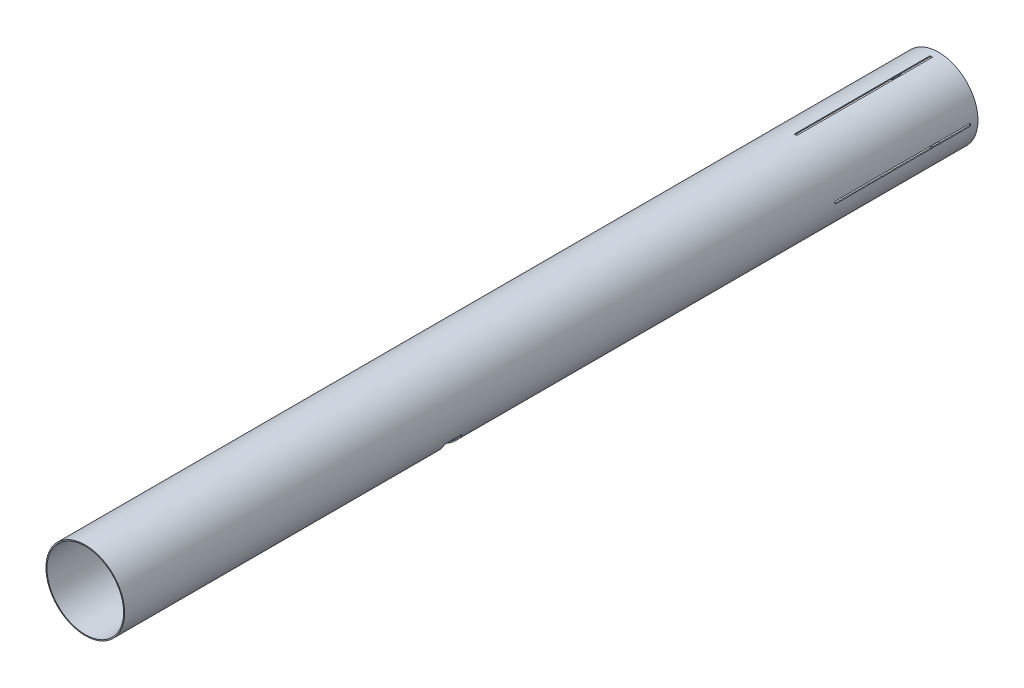
ISO-10303-21;
HEADER;
FILE_DESCRIPTION(('STEP AP214'),'2;1');
FILE_NAME('part.step','',(''),(''),'','','');
FILE_SCHEMA(('AUTOMOTIVE_DESIGN { 1 0 10303 214 1 1 1 1 }'));
ENDSEC;
DATA;
#1=APPLICATION_CONTEXT('core data for automotive mechanical design processes');
#2=APPLICATION_PROTOCOL_DEFINITION('international standard','automotive_design',2000,#1);
#3=PRODUCT_CONTEXT('',#1,'mechanical');
#4=PRODUCT('Part','Part','',(#3));
#5=PRODUCT_RELATED_PRODUCT_CATEGORY('part','',(#4));
#6=PRODUCT_DEFINITION_FORMATION('','',#4);
#7=PRODUCT_DEFINITION_CONTEXT('part definition',#1,'design');
#8=PRODUCT_DEFINITION('design','',#6,#7);
#9=PRODUCT_DEFINITION_SHAPE('','',#8);
#10=(LENGTH_UNIT() NAMED_UNIT(*) SI_UNIT(.MILLI.,.METRE.));
#11=(NAMED_UNIT(*) PLANE_ANGLE_UNIT() SI_UNIT($,.RADIAN.));
#12=(NAMED_UNIT(*) SI_UNIT($,.STERADIAN.) SOLID_ANGLE_UNIT());
#13=UNCERTAINTY_MEASURE_WITH_UNIT(LENGTH_MEASURE(1.E-05),#10,'distance_accuracy_value','');
#14=(GEOMETRIC_REPRESENTATION_CONTEXT(3) GLOBAL_UNCERTAINTY_ASSIGNED_CONTEXT((#13)) GLOBAL_UNIT_ASSIGNED_CONTEXT((#10,
#11,#12)) REPRESENTATION_CONTEXT('',''));
#15=CARTESIAN_POINT('',(0.,0.,0.));
#16=DIRECTION('',(0.,0.,1.));
#17=DIRECTION('',(1.,0.,0.));
#18=AXIS2_PLACEMENT_3D('',#15,#16,#17);
#19=CARTESIAN_POINT('',(0.,0.,1700.));
#20=DIRECTION('',(0.,0.,-1.));
#21=DIRECTION('',(-1.,0.,0.));
#22=AXIS2_PLACEMENT_3D('',#19,#20,#21);
#23=CYLINDRICAL_SURFACE('',#22,78.35);
#24=DIRECTION('',(0.,0.,-1.));
#25=VECTOR('',#24,1.);
#26=CARTESIAN_POINT('',(37.9692206941715,-68.5351061856425,1052.5));
#27=LINE('',#26,#25);
#28=CARTESIAN_POINT('',(37.9692206941715,-68.5351061856425,1052.5));
#29=VERTEX_POINT('',#28);
#30=CARTESIAN_POINT('',(37.9692206941715,-68.5351061856425,1017.5));
#31=VERTEX_POINT('',#30);
#32=EDGE_CURVE('E190',#29,#31,#27,.T.);
#33=ORIENTED_EDGE('',*,*,#32,.F.);
#34=CARTESIAN_POINT('',(0.,0.,1052.5));
#35=DIRECTION('',(0.,0.,1.));
#36=DIRECTION('',(1.,0.,0.));
#37=AXIS2_PLACEMENT_3D('',#34,#35,#36);
#38=CIRCLE('',#37,78.35);
#39=CARTESIAN_POINT('',(68.6693730930893,-37.7258492151219,1052.5));
#40=VERTEX_POINT('',#39);
#41=EDGE_CURVE('E626',#40,#29,#38,.F.);
#42=ORIENTED_EDGE('',*,*,#41,.F.);
#43=DIRECTION('',(0.,0.,-1.));
#44=VECTOR('',#43,1.);
#45=CARTESIAN_POINT('',(68.6693730930893,-37.7258492151219,1052.5));
#46=LINE('',#45,#44);
#47=CARTESIAN_POINT('',(68.6693730930893,-37.7258492151219,1017.5));
#48=VERTEX_POINT('',#47);
#49=EDGE_CURVE('E214',#40,#48,#46,.T.);
#50=ORIENTED_EDGE('',*,*,#49,.T.);
#51=CARTESIAN_POINT('',(0.,0.,1017.5));
#52=DIRECTION('',(0.,0.,1.));
#53=DIRECTION('',(1.,0.,0.));
#54=AXIS2_PLACEMENT_3D('',#51,#52,#53);
#55=CIRCLE('',#54,78.35);
#56=EDGE_CURVE('E193',#48,#31,#55,.F.);
#57=ORIENTED_EDGE('',*,*,#56,.T.);
#58=EDGE_LOOP('',(#33,#42,#50,#57));
#59=FACE_BOUND('',#58,.T.);
#60=DIRECTION('',(0.,0.,-1.));
#61=VECTOR('',#60,1.);
#62=CARTESIAN_POINT('',(78.3132332367908,2.40000000000029,1700.));
#63=LINE('',#62,#61);
#64=CARTESIAN_POINT('',(78.3132332367908,2.4000000000003,285.));
#65=VERTEX_POINT('',#64);
#66=CARTESIAN_POINT('',(78.3132332367908,2.40000000000029,14.9999999999999));
#67=VERTEX_POINT('',#66);
#68=EDGE_CURVE('E235',#65,#67,#63,.T.);
#69=ORIENTED_EDGE('',*,*,#68,.T.);
#70=CARTESIAN_POINT('',(0.,0.,14.9999999999999));
#71=DIRECTION('',(0.,0.,-1.));
#72=DIRECTION('',(-1.,0.,0.));
#73=AXIS2_PLACEMENT_3D('',#70,#71,#72);
#74=CIRCLE('',#73,78.35);
#75=CARTESIAN_POINT('',(78.3132332367909,-2.3999999999997,14.9999999999999));
#76=VERTEX_POINT('',#75);
#77=EDGE_CURVE('E240',#67,#76,#74,.T.);
#78=ORIENTED_EDGE('',*,*,#77,.T.);
#79=DIRECTION('',(0.,0.,-1.));
#80=VECTOR('',#79,1.);
#81=CARTESIAN_POINT('',(78.3132332367909,-2.3999999999997,1700.));
#82=LINE('',#81,#80);
#83=CARTESIAN_POINT('',(78.3132332367909,-2.3999999999997,285.));
#84=VERTEX_POINT('',#83);
#85=EDGE_CURVE('E241',#76,#84,#82,.F.);
#86=ORIENTED_EDGE('',*,*,#85,.T.);
#87=CARTESIAN_POINT('',(0.,0.,285.));
#88=DIRECTION('',(0.,0.,1.));
#89=DIRECTION('',(1.,0.,0.));
#90=AXIS2_PLACEMENT_3D('',#87,#88,#89);
#91=CIRCLE('',#90,78.35);
#92=EDGE_CURVE('E247',#84,#65,#91,.T.);
#93=ORIENTED_EDGE('',*,*,#92,.T.);
#94=EDGE_LOOP('',(#69,#78,#86,#93));
#95=FACE_BOUND('',#94,.T.);
#96=CARTESIAN_POINT('',(-78.3132332367908,-2.40000000000025,14.9999999999999));
#97=VERTEX_POINT('',#96);
#98=CARTESIAN_POINT('',(-78.3132332367909,2.39999999999975,14.9999999999999));
#99=VERTEX_POINT('',#98);
#100=EDGE_CURVE('E238',#97,#99,#74,.T.);
#101=ORIENTED_EDGE('',*,*,#100,.T.);
#102=DIRECTION('',(0.,0.,-1.));
#103=VECTOR('',#102,1.);
#104=CARTESIAN_POINT('',(-78.3132332367909,2.39999999999975,1700.));
#105=LINE('',#104,#103);
#106=CARTESIAN_POINT('',(-78.3132332367909,2.39999999999975,285.));
#107=VERTEX_POINT('',#106);
#108=EDGE_CURVE('E232',#99,#107,#105,.F.);
#109=ORIENTED_EDGE('',*,*,#108,.T.);
#110=CARTESIAN_POINT('',(-78.3132332367908,-2.40000000000025,285.));
#111=VERTEX_POINT('',#110);
#112=EDGE_CURVE('E249',#107,#111,#91,.T.);
#113=ORIENTED_EDGE('',*,*,#112,.T.);
#114=DIRECTION('',(0.,0.,-1.));
#115=VECTOR('',#114,1.);
#116=CARTESIAN_POINT('',(-78.3132332367908,-2.40000000000025,1700.));
#117=LINE('',#116,#115);
#118=EDGE_CURVE('E244',#111,#97,#117,.T.);
#119=ORIENTED_EDGE('',*,*,#118,.T.);
#120=EDGE_LOOP('',(#101,#109,#113,#119));
#121=FACE_BOUND('',#120,.T.);
#122=DIRECTION('',(0.,0.,-1.));
#123=VECTOR('',#122,1.);
#124=CARTESIAN_POINT('',(2.40000000000002,-78.3132332367909,1700.));
#125=LINE('',#124,#123);
#126=CARTESIAN_POINT('',(2.40000000000002,-78.3132332367909,285.));
#127=VERTEX_POINT('',#126);
#128=CARTESIAN_POINT('',(2.40000000000002,-78.3132332367909,14.9999999999999));
#129=VERTEX_POINT('',#128);
#130=EDGE_CURVE('E268',#127,#129,#125,.T.);
#131=ORIENTED_EDGE('',*,*,#130,.T.);
#132=CARTESIAN_POINT('',(0.,0.,14.9999999999999));
#133=DIRECTION('',(0.,0.,-1.));
#134=DIRECTION('',(-1.,0.,0.));
#135=AXIS2_PLACEMENT_3D('',#132,#133,#134);
#136=CIRCLE('',#135,78.35);
#137=CARTESIAN_POINT('',(-2.39999999999997,-78.3132332367909,14.9999999999999));
#138=VERTEX_POINT('',#137);
#139=EDGE_CURVE('E271',#129,#138,#136,.T.);
#140=ORIENTED_EDGE('',*,*,#139,.T.);
#141=DIRECTION('',(0.,0.,-1.));
#142=VECTOR('',#141,1.);
#143=CARTESIAN_POINT('',(-2.39999999999998,-78.3132332367909,1700.));
#144=LINE('',#143,#142);
#145=CARTESIAN_POINT('',(-2.39999999999997,-78.3132332367909,285.));
#146=VERTEX_POINT('',#145);
#147=EDGE_CURVE('E274',#138,#146,#144,.F.);
#148=ORIENTED_EDGE('',*,*,#147,.T.);
#149=CARTESIAN_POINT('',(0.,0.,285.));
#150=DIRECTION('',(0.,0.,1.));
#151=DIRECTION('',(1.,0.,0.));
#152=AXIS2_PLACEMENT_3D('',#149,#150,#151);
#153=CIRCLE('',#152,78.35);
#154=EDGE_CURVE('E280',#146,#127,#153,.T.);
#155=ORIENTED_EDGE('',*,*,#154,.T.);
#156=EDGE_LOOP('',(#131,#140,#148,#155));
#157=FACE_BOUND('',#156,.T.);
#158=DIRECTION('',(0.,0.,-1.));
#159=VECTOR('',#158,1.);
#160=CARTESIAN_POINT('',(-2.39999999999998,78.3132332367909,1700.));
#161=LINE('',#160,#159);
#162=CARTESIAN_POINT('',(-2.39999999999997,78.3132332367909,285.));
#163=VERTEX_POINT('',#162);
#164=CARTESIAN_POINT('',(-2.39999999999997,78.3132332367909,14.9999999999999));
#165=VERTEX_POINT('',#164);
#166=EDGE_CURVE('E277',#163,#165,#161,.T.);
#167=ORIENTED_EDGE('',*,*,#166,.T.);
#168=CARTESIAN_POINT('',(2.40000000000003,78.3132332367909,14.9999999999999));
#169=VERTEX_POINT('',#168);
#170=EDGE_CURVE('E272',#165,#169,#136,.T.);
#171=ORIENTED_EDGE('',*,*,#170,.T.);
#172=DIRECTION('',(0.,0.,-1.));
#173=VECTOR('',#172,1.);
#174=CARTESIAN_POINT('',(2.40000000000002,78.3132332367909,1700.));
#175=LINE('',#174,#173);
#176=CARTESIAN_POINT('',(2.40000000000002,78.3132332367909,285.));
#177=VERTEX_POINT('',#176);
#178=EDGE_CURVE('E265',#169,#177,#175,.F.);
#179=ORIENTED_EDGE('',*,*,#178,.T.);
#180=EDGE_CURVE('E281',#177,#163,#153,.T.);
#181=ORIENTED_EDGE('',*,*,#180,.T.);
#182=EDGE_LOOP('',(#167,#171,#179,#181));
#183=FACE_BOUND('',#182,.T.);
#184=CARTESIAN_POINT('',(0.,0.,1700.));
#185=DIRECTION('',(0.,0.,1.));
#186=DIRECTION('',(1.,0.,0.));
#187=AXIS2_PLACEMENT_3D('',#184,#185,#186);
#188=CIRCLE('',#187,78.35);
#189=CARTESIAN_POINT('',(78.35,0.,1700.));
#190=VERTEX_POINT('',#189);
#191=EDGE_CURVE('E291',#190,#190,#188,.T.);
#192=ORIENTED_EDGE('',*,*,#191,.F.);
#193=EDGE_LOOP('',(#192));
#194=FACE_BOUND('',#193,.T.);
#195=CARTESIAN_POINT('',(0.,0.,0.));
#196=DIRECTION('',(0.,0.,1.));
#197=DIRECTION('',(1.,0.,0.));
#198=AXIS2_PLACEMENT_3D('',#195,#196,#197);
#199=CIRCLE('',#198,78.35);
#200=CARTESIAN_POINT('',(78.35,0.,0.));
#201=VERTEX_POINT('',#200);
#202=EDGE_CURVE('E288',#201,#201,#199,.T.);
#203=ORIENTED_EDGE('',*,*,#202,.T.);
#204=EDGE_LOOP('',(#203));
#205=FACE_BOUND('',#204,.T.);
#206=ADVANCED_FACE('F43',(#59,#95,#121,#157,#183,#194,#205),#23,.T.);
#207=CARTESIAN_POINT('',(0.,0.,1700.));
#208=DIRECTION('',(0.,0.,-1.));
#209=DIRECTION('',(-1.,0.,0.));
#210=AXIS2_PLACEMENT_3D('',#207,#208,#209);
#211=CYLINDRICAL_SURFACE('',#210,76.35);
#212=CARTESIAN_POINT('',(0.,0.,1052.5));
#213=DIRECTION('',(0.,0.,1.));
#214=DIRECTION('',(1.,0.,0.));
#215=AXIS2_PLACEMENT_3D('',#212,#213,#214);
#216=CIRCLE('',#215,76.35);
#217=CARTESIAN_POINT('',(66.9164854582944,-36.7628409390499,1052.5));
#218=VERTEX_POINT('',#217);
#219=CARTESIAN_POINT('',(37.,-66.7856459128756,1052.5));
#220=VERTEX_POINT('',#219);
#221=EDGE_CURVE('E205',#218,#220,#216,.F.);
#222=ORIENTED_EDGE('',*,*,#221,.T.);
#223=DIRECTION('',(0.,0.,-1.));
#224=VECTOR('',#223,1.);
#225=CARTESIAN_POINT('',(37.,-66.7856459128756,1052.5));
#226=LINE('',#225,#224);
#227=CARTESIAN_POINT('',(37.,-66.7856459128756,1017.5));
#228=VERTEX_POINT('',#227);
#229=EDGE_CURVE('E187',#220,#228,#226,.T.);
#230=ORIENTED_EDGE('',*,*,#229,.T.);
#231=CARTESIAN_POINT('',(0.,0.,1017.5));
#232=DIRECTION('',(0.,0.,1.));
#233=DIRECTION('',(1.,0.,0.));
#234=AXIS2_PLACEMENT_3D('',#231,#232,#233);
#235=CIRCLE('',#234,76.35);
#236=CARTESIAN_POINT('',(66.9164854582944,-36.7628409390499,1017.5));
#237=VERTEX_POINT('',#236);
#238=EDGE_CURVE('E194',#237,#228,#235,.F.);
#239=ORIENTED_EDGE('',*,*,#238,.F.);
#240=DIRECTION('',(0.,0.,-1.));
#241=VECTOR('',#240,1.);
#242=CARTESIAN_POINT('',(66.9164854582944,-36.7628409390499,1052.5));
#243=LINE('',#242,#241);
#244=EDGE_CURVE('E207',#218,#237,#243,.T.);
#245=ORIENTED_EDGE('',*,*,#244,.F.);
#246=EDGE_LOOP('',(#222,#230,#239,#245));
#247=FACE_BOUND('',#246,.T.);
#248=CARTESIAN_POINT('',(0.,0.,285.));
#249=DIRECTION('',(0.,0.,1.));
#250=DIRECTION('',(1.,0.,0.));
#251=AXIS2_PLACEMENT_3D('',#248,#249,#250);
#252=CIRCLE('',#251,76.35);
#253=CARTESIAN_POINT('',(76.312269655672,-2.39999999999971,285.));
#254=VERTEX_POINT('',#253);
#255=CARTESIAN_POINT('',(76.312269655672,2.40000000000029,285.));
#256=VERTEX_POINT('',#255);
#257=EDGE_CURVE('E11',#254,#256,#252,.T.);
#258=ORIENTED_EDGE('',*,*,#257,.F.);
#259=DIRECTION('',(0.,0.,-1.));
#260=VECTOR('',#259,1.);
#261=CARTESIAN_POINT('',(76.312269655672,-2.39999999999971,1700.));
#262=LINE('',#261,#260);
#263=CARTESIAN_POINT('',(76.312269655672,-2.39999999999971,14.9999999999999));
#264=VERTEX_POINT('',#263);
#265=EDGE_CURVE('E46',#264,#254,#262,.F.);
#266=ORIENTED_EDGE('',*,*,#265,.F.);
#267=CARTESIAN_POINT('',(0.,0.,14.9999999999999));
#268=DIRECTION('',(0.,0.,-1.));
#269=DIRECTION('',(-1.,0.,0.));
#270=AXIS2_PLACEMENT_3D('',#267,#268,#269);
#271=CIRCLE('',#270,76.35);
#272=CARTESIAN_POINT('',(76.312269655672,2.40000000000029,14.9999999999999));
#273=VERTEX_POINT('',#272);
#274=EDGE_CURVE('E318',#273,#264,#271,.T.);
#275=ORIENTED_EDGE('',*,*,#274,.F.);
#276=DIRECTION('',(0.,0.,-1.));
#277=VECTOR('',#276,1.);
#278=CARTESIAN_POINT('',(76.312269655672,2.40000000000029,1700.));
#279=LINE('',#278,#277);
#280=EDGE_CURVE('E319',#256,#273,#279,.T.);
#281=ORIENTED_EDGE('',*,*,#280,.F.);
#282=EDGE_LOOP('',(#258,#266,#275,#281));
#283=FACE_BOUND('',#282,.T.);
#284=CARTESIAN_POINT('',(-76.312269655672,2.39999999999976,285.));
#285=VERTEX_POINT('',#284);
#286=CARTESIAN_POINT('',(-76.312269655672,-2.40000000000024,285.));
#287=VERTEX_POINT('',#286);
#288=EDGE_CURVE('E52',#285,#287,#252,.T.);
#289=ORIENTED_EDGE('',*,*,#288,.F.);
#290=DIRECTION('',(0.,0.,-1.));
#291=VECTOR('',#290,1.);
#292=CARTESIAN_POINT('',(-76.312269655672,2.39999999999975,1700.));
#293=LINE('',#292,#291);
#294=CARTESIAN_POINT('',(-76.312269655672,2.39999999999975,14.9999999999999));
#295=VERTEX_POINT('',#294);
#296=EDGE_CURVE('E312',#295,#285,#293,.F.);
#297=ORIENTED_EDGE('',*,*,#296,.F.);
#298=CARTESIAN_POINT('',(-76.312269655672,-2.40000000000024,14.9999999999999));
#299=VERTEX_POINT('',#298);
#300=EDGE_CURVE('E314',#299,#295,#271,.T.);
#301=ORIENTED_EDGE('',*,*,#300,.F.);
#302=DIRECTION('',(0.,0.,-1.));
#303=VECTOR('',#302,1.);
#304=CARTESIAN_POINT('',(-76.312269655672,-2.40000000000024,1700.));
#305=LINE('',#304,#303);
#306=EDGE_CURVE('E317',#287,#299,#305,.T.);
#307=ORIENTED_EDGE('',*,*,#306,.F.);
#308=EDGE_LOOP('',(#289,#297,#301,#307));
#309=FACE_BOUND('',#308,.T.);
#310=CARTESIAN_POINT('',(0.,0.,285.));
#311=DIRECTION('',(0.,0.,1.));
#312=DIRECTION('',(1.,0.,0.));
#313=AXIS2_PLACEMENT_3D('',#310,#311,#312);
#314=CIRCLE('',#313,76.35);
#315=CARTESIAN_POINT('',(-2.39999999999997,-76.312269655672,285.));
#316=VERTEX_POINT('',#315);
#317=CARTESIAN_POINT('',(2.40000000000002,-76.312269655672,285.));
#318=VERTEX_POINT('',#317);
#319=EDGE_CURVE('E308',#316,#318,#314,.T.);
#320=ORIENTED_EDGE('',*,*,#319,.F.);
#321=DIRECTION('',(0.,0.,-1.));
#322=VECTOR('',#321,1.);
#323=CARTESIAN_POINT('',(-2.39999999999998,-76.312269655672,1700.));
#324=LINE('',#323,#322);
#325=CARTESIAN_POINT('',(-2.39999999999997,-76.312269655672,14.9999999999999));
#326=VERTEX_POINT('',#325);
#327=EDGE_CURVE('E310',#326,#316,#324,.F.);
#328=ORIENTED_EDGE('',*,*,#327,.F.);
#329=CARTESIAN_POINT('',(0.,0.,14.9999999999999));
#330=DIRECTION('',(0.,0.,-1.));
#331=DIRECTION('',(-1.,0.,0.));
#332=AXIS2_PLACEMENT_3D('',#329,#330,#331);
#333=CIRCLE('',#332,76.35);
#334=CARTESIAN_POINT('',(2.40000000000003,-76.312269655672,14.9999999999999));
#335=VERTEX_POINT('',#334);
#336=EDGE_CURVE('E303',#335,#326,#333,.T.);
#337=ORIENTED_EDGE('',*,*,#336,.F.);
#338=DIRECTION('',(0.,0.,-1.));
#339=VECTOR('',#338,1.);
#340=CARTESIAN_POINT('',(2.40000000000002,-76.312269655672,1700.));
#341=LINE('',#340,#339);
#342=EDGE_CURVE('E307',#318,#335,#341,.T.);
#343=ORIENTED_EDGE('',*,*,#342,.F.);
#344=EDGE_LOOP('',(#320,#328,#337,#343));
#345=FACE_BOUND('',#344,.T.);
#346=CARTESIAN_POINT('',(2.40000000000002,76.312269655672,285.));
#347=VERTEX_POINT('',#346);
#348=CARTESIAN_POINT('',(-2.39999999999997,76.312269655672,285.));
#349=VERTEX_POINT('',#348);
#350=EDGE_CURVE('E305',#347,#349,#314,.T.);
#351=ORIENTED_EDGE('',*,*,#350,.F.);
#352=DIRECTION('',(0.,0.,-1.));
#353=VECTOR('',#352,1.);
#354=CARTESIAN_POINT('',(2.40000000000002,76.312269655672,1700.));
#355=LINE('',#354,#353);
#356=CARTESIAN_POINT('',(2.40000000000002,76.312269655672,14.9999999999999));
#357=VERTEX_POINT('',#356);
#358=EDGE_CURVE('E295',#357,#347,#355,.F.);
#359=ORIENTED_EDGE('',*,*,#358,.F.);
#360=CARTESIAN_POINT('',(-2.39999999999997,76.312269655672,14.9999999999999));
#361=VERTEX_POINT('',#360);
#362=EDGE_CURVE('E299',#361,#357,#333,.T.);
#363=ORIENTED_EDGE('',*,*,#362,.F.);
#364=DIRECTION('',(0.,0.,-1.));
#365=VECTOR('',#364,1.);
#366=CARTESIAN_POINT('',(-2.39999999999998,76.312269655672,1700.));
#367=LINE('',#366,#365);
#368=EDGE_CURVE('E302',#349,#361,#367,.T.);
#369=ORIENTED_EDGE('',*,*,#368,.F.);
#370=EDGE_LOOP('',(#351,#359,#363,#369));
#371=FACE_BOUND('',#370,.T.);
#372=CARTESIAN_POINT('',(0.,0.,0.));
#373=DIRECTION('',(0.,0.,1.));
#374=DIRECTION('',(1.,0.,0.));
#375=AXIS2_PLACEMENT_3D('',#372,#373,#374);
#376=CIRCLE('',#375,76.35);
#377=CARTESIAN_POINT('',(76.35,0.,0.));
#378=VERTEX_POINT('',#377);
#379=EDGE_CURVE('E283',#378,#378,#376,.T.);
#380=ORIENTED_EDGE('',*,*,#379,.F.);
#381=EDGE_LOOP('',(#380));
#382=FACE_BOUND('',#381,.T.);
#383=CARTESIAN_POINT('',(0.,0.,1700.));
#384=DIRECTION('',(0.,0.,1.));
#385=DIRECTION('',(1.,0.,0.));
#386=AXIS2_PLACEMENT_3D('',#383,#384,#385);
#387=CIRCLE('',#386,76.35);
#388=CARTESIAN_POINT('',(76.35,0.,1700.));
#389=VERTEX_POINT('',#388);
#390=EDGE_CURVE('E284',#389,#389,#387,.T.);
#391=ORIENTED_EDGE('',*,*,#390,.T.);
#392=EDGE_LOOP('',(#391));
#393=FACE_BOUND('',#392,.T.);
#394=ADVANCED_FACE('F203',(#247,#283,#309,#345,#371,#382,#393),#211,.F.);
#395=CARTESIAN_POINT('',(0.,0.,1700.));
#396=DIRECTION('',(0.,0.,1.));
#397=DIRECTION('',(1.,0.,0.));
#398=AXIS2_PLACEMENT_3D('',#395,#396,#397);
#399=PLANE('',#398);
#400=ORIENTED_EDGE('',*,*,#191,.T.);
#401=EDGE_LOOP('',(#400));
#402=FACE_BOUND('',#401,.T.);
#403=ORIENTED_EDGE('',*,*,#390,.F.);
#404=EDGE_LOOP('',(#403));
#405=FACE_BOUND('',#404,.T.);
#406=ADVANCED_FACE('F339',(#402,#405),#399,.T.);
#407=CARTESIAN_POINT('',(0.,0.,0.));
#408=DIRECTION('',(0.,0.,1.));
#409=DIRECTION('',(1.,0.,0.));
#410=AXIS2_PLACEMENT_3D('',#407,#408,#409);
#411=PLANE('',#410);
#412=ORIENTED_EDGE('',*,*,#202,.F.);
#413=EDGE_LOOP('',(#412));
#414=FACE_BOUND('',#413,.T.);
#415=ORIENTED_EDGE('',*,*,#379,.T.);
#416=EDGE_LOOP('',(#415));
#417=FACE_BOUND('',#416,.T.);
#418=ADVANCED_FACE('F359',(#414,#417),#411,.F.);
#419=CARTESIAN_POINT('',(2.40000000000002,-78.35,285.));
#420=DIRECTION('',(1.,0.,0.));
#421=DIRECTION('',(0.,0.,-1.));
#422=AXIS2_PLACEMENT_3D('',#419,#420,#421);
#423=PLANE('',#422);
#424=DIRECTION('',(0.,1.,0.));
#425=VECTOR('',#424,1.);
#426=CARTESIAN_POINT('',(2.40000000000003,-78.35,14.9999999999999));
#427=LINE('',#426,#425);
#428=EDGE_CURVE('E259',#357,#169,#427,.T.);
#429=ORIENTED_EDGE('',*,*,#428,.F.);
#430=ORIENTED_EDGE('',*,*,#358,.T.);
#431=DIRECTION('',(0.,1.,0.));
#432=VECTOR('',#431,1.);
#433=CARTESIAN_POINT('',(2.40000000000002,-78.35,285.));
#434=LINE('',#433,#432);
#435=EDGE_CURVE('E263',#347,#177,#434,.T.);
#436=ORIENTED_EDGE('',*,*,#435,.T.);
#437=ORIENTED_EDGE('',*,*,#178,.F.);
#438=EDGE_LOOP('',(#429,#430,#436,#437));
#439=FACE_BOUND('',#438,.T.);
#440=ADVANCED_FACE('F365',(#439),#423,.F.);
#441=CARTESIAN_POINT('',(-2.39999999999997,-78.35,14.9999999999999));
#442=DIRECTION('',(0.,0.,-1.));
#443=DIRECTION('',(-1.,0.,0.));
#444=AXIS2_PLACEMENT_3D('',#441,#442,#443);
#445=PLANE('',#444);
#446=DIRECTION('',(0.,1.,0.));
#447=VECTOR('',#446,1.);
#448=CARTESIAN_POINT('',(-2.39999999999997,-78.35,14.9999999999999));
#449=LINE('',#448,#447);
#450=EDGE_CURVE('E255',#361,#165,#449,.T.);
#451=ORIENTED_EDGE('',*,*,#450,.F.);
#452=ORIENTED_EDGE('',*,*,#362,.T.);
#453=ORIENTED_EDGE('',*,*,#428,.T.);
#454=ORIENTED_EDGE('',*,*,#170,.F.);
#455=EDGE_LOOP('',(#451,#452,#453,#454));
#456=FACE_BOUND('',#455,.T.);
#457=ADVANCED_FACE('F397',(#456),#445,.F.);
#458=CARTESIAN_POINT('',(-2.39999999999997,-78.35,285.));
#459=DIRECTION('',(-1.,0.,0.));
#460=DIRECTION('',(0.,0.,1.));
#461=AXIS2_PLACEMENT_3D('',#458,#459,#460);
#462=PLANE('',#461);
#463=DIRECTION('',(0.,1.,0.));
#464=VECTOR('',#463,1.);
#465=CARTESIAN_POINT('',(-2.39999999999997,-78.35,285.));
#466=LINE('',#465,#464);
#467=EDGE_CURVE('E250',#349,#163,#466,.T.);
#468=ORIENTED_EDGE('',*,*,#467,.F.);
#469=ORIENTED_EDGE('',*,*,#368,.T.);
#470=ORIENTED_EDGE('',*,*,#450,.T.);
#471=ORIENTED_EDGE('',*,*,#166,.F.);
#472=EDGE_LOOP('',(#468,#469,#470,#471));
#473=FACE_BOUND('',#472,.T.);
#474=ADVANCED_FACE('F389',(#473),#462,.F.);
#475=CARTESIAN_POINT('',(-2.39999999999997,-78.35,285.));
#476=DIRECTION('',(0.,0.,1.));
#477=DIRECTION('',(1.,0.,0.));
#478=AXIS2_PLACEMENT_3D('',#475,#476,#477);
#479=PLANE('',#478);
#480=ORIENTED_EDGE('',*,*,#435,.F.);
#481=ORIENTED_EDGE('',*,*,#350,.T.);
#482=ORIENTED_EDGE('',*,*,#467,.T.);
#483=ORIENTED_EDGE('',*,*,#180,.F.);
#484=EDGE_LOOP('',(#480,#481,#482,#483));
#485=FACE_BOUND('',#484,.T.);
#486=ADVANCED_FACE('F393',(#485),#479,.F.);
#487=EDGE_CURVE('E253',#146,#316,#466,.T.);
#488=ORIENTED_EDGE('',*,*,#487,.T.);
#489=ORIENTED_EDGE('',*,*,#319,.T.);
#490=EDGE_CURVE('E262',#127,#318,#434,.T.);
#491=ORIENTED_EDGE('',*,*,#490,.F.);
#492=ORIENTED_EDGE('',*,*,#154,.F.);
#493=EDGE_LOOP('',(#488,#489,#491,#492));
#494=FACE_BOUND('',#493,.T.);
#495=ADVANCED_FACE('F417',(#494),#479,.F.);
#496=EDGE_CURVE('E254',#138,#326,#449,.T.);
#497=ORIENTED_EDGE('',*,*,#496,.T.);
#498=ORIENTED_EDGE('',*,*,#327,.T.);
#499=ORIENTED_EDGE('',*,*,#487,.F.);
#500=ORIENTED_EDGE('',*,*,#147,.F.);
#501=EDGE_LOOP('',(#497,#498,#499,#500));
#502=FACE_BOUND('',#501,.T.);
#503=ADVANCED_FACE('F406',(#502),#462,.F.);
#504=EDGE_CURVE('E258',#129,#335,#427,.T.);
#505=ORIENTED_EDGE('',*,*,#504,.T.);
#506=ORIENTED_EDGE('',*,*,#336,.T.);
#507=ORIENTED_EDGE('',*,*,#496,.F.);
#508=ORIENTED_EDGE('',*,*,#139,.F.);
#509=EDGE_LOOP('',(#505,#506,#507,#508));
#510=FACE_BOUND('',#509,.T.);
#511=ADVANCED_FACE('F400',(#510),#445,.F.);
#512=ORIENTED_EDGE('',*,*,#490,.T.);
#513=ORIENTED_EDGE('',*,*,#342,.T.);
#514=ORIENTED_EDGE('',*,*,#504,.F.);
#515=ORIENTED_EDGE('',*,*,#130,.F.);
#516=EDGE_LOOP('',(#512,#513,#514,#515));
#517=FACE_BOUND('',#516,.T.);
#518=ADVANCED_FACE('F408',(#517),#423,.F.);
#519=CARTESIAN_POINT('',(78.3500000000003,2.4000000000003,285.));
#520=DIRECTION('',(0.,1.,0.));
#521=DIRECTION('',(-1.,0.,0.));
#522=AXIS2_PLACEMENT_3D('',#519,#520,#521);
#523=PLANE('',#522);
#524=DIRECTION('',(-1.,0.,0.));
#525=VECTOR('',#524,1.);
#526=CARTESIAN_POINT('',(78.3500000000003,2.4000000000003,14.9999999999999));
#527=LINE('',#526,#525);
#528=EDGE_CURVE('E227',#295,#99,#527,.T.);
#529=ORIENTED_EDGE('',*,*,#528,.F.);
#530=ORIENTED_EDGE('',*,*,#296,.T.);
#531=DIRECTION('',(-1.,0.,0.));
#532=VECTOR('',#531,1.);
#533=CARTESIAN_POINT('',(78.3500000000003,2.4000000000003,285.));
#534=LINE('',#533,#532);
#535=EDGE_CURVE('E211',#285,#107,#534,.T.);
#536=ORIENTED_EDGE('',*,*,#535,.T.);
#537=ORIENTED_EDGE('',*,*,#108,.F.);
#538=EDGE_LOOP('',(#529,#530,#536,#537));
#539=FACE_BOUND('',#538,.T.);
#540=ADVANCED_FACE('F415',(#539),#523,.F.);
#541=CARTESIAN_POINT('',(78.3500000000003,-2.3999999999997,14.9999999999999));
#542=DIRECTION('',(0.,0.,-1.));
#543=DIRECTION('',(-1.,0.,0.));
#544=AXIS2_PLACEMENT_3D('',#541,#542,#543);
#545=PLANE('',#544);
#546=ORIENTED_EDGE('',*,*,#100,.F.);
#547=DIRECTION('',(-1.,0.,0.));
#548=VECTOR('',#547,1.);
#549=CARTESIAN_POINT('',(78.3500000000003,-2.3999999999997,14.9999999999999));
#550=LINE('',#549,#548);
#551=EDGE_CURVE('E223',#299,#97,#550,.T.);
#552=ORIENTED_EDGE('',*,*,#551,.F.);
#553=ORIENTED_EDGE('',*,*,#300,.T.);
#554=ORIENTED_EDGE('',*,*,#528,.T.);
#555=EDGE_LOOP('',(#546,#552,#553,#554));
#556=FACE_BOUND('',#555,.T.);
#557=ADVANCED_FACE('F495',(#556),#545,.F.);
#558=CARTESIAN_POINT('',(78.3500000000003,-2.3999999999997,285.));
#559=DIRECTION('',(0.,-1.,0.));
#560=DIRECTION('',(1.,0.,0.));
#561=AXIS2_PLACEMENT_3D('',#558,#559,#560);
#562=PLANE('',#561);
#563=DIRECTION('',(-1.,0.,0.));
#564=VECTOR('',#563,1.);
#565=CARTESIAN_POINT('',(78.3500000000003,-2.3999999999997,285.));
#566=LINE('',#565,#564);
#567=EDGE_CURVE('E218',#287,#111,#566,.T.);
#568=ORIENTED_EDGE('',*,*,#567,.F.);
#569=ORIENTED_EDGE('',*,*,#306,.T.);
#570=ORIENTED_EDGE('',*,*,#551,.T.);
#571=ORIENTED_EDGE('',*,*,#118,.F.);
#572=EDGE_LOOP('',(#568,#569,#570,#571));
#573=FACE_BOUND('',#572,.T.);
#574=ADVANCED_FACE('F504',(#573),#562,.F.);
#575=CARTESIAN_POINT('',(78.3500000000003,-2.3999999999997,285.));
#576=DIRECTION('',(0.,0.,1.));
#577=DIRECTION('',(1.,0.,0.));
#578=AXIS2_PLACEMENT_3D('',#575,#576,#577);
#579=PLANE('',#578);
#580=ORIENTED_EDGE('',*,*,#535,.F.);
#581=ORIENTED_EDGE('',*,*,#288,.T.);
#582=ORIENTED_EDGE('',*,*,#567,.T.);
#583=ORIENTED_EDGE('',*,*,#112,.F.);
#584=EDGE_LOOP('',(#580,#581,#582,#583));
#585=FACE_BOUND('',#584,.T.);
#586=ADVANCED_FACE('F512',(#585),#579,.F.);
#587=ORIENTED_EDGE('',*,*,#92,.F.);
#588=EDGE_CURVE('E221',#84,#254,#566,.T.);
#589=ORIENTED_EDGE('',*,*,#588,.T.);
#590=ORIENTED_EDGE('',*,*,#257,.T.);
#591=EDGE_CURVE('E230',#65,#256,#534,.T.);
#592=ORIENTED_EDGE('',*,*,#591,.F.);
#593=EDGE_LOOP('',(#587,#589,#590,#592));
#594=FACE_BOUND('',#593,.T.);
#595=ADVANCED_FACE('F335',(#594),#579,.F.);
#596=EDGE_CURVE('E222',#76,#264,#550,.T.);
#597=ORIENTED_EDGE('',*,*,#596,.T.);
#598=ORIENTED_EDGE('',*,*,#265,.T.);
#599=ORIENTED_EDGE('',*,*,#588,.F.);
#600=ORIENTED_EDGE('',*,*,#85,.F.);
#601=EDGE_LOOP('',(#597,#598,#599,#600));
#602=FACE_BOUND('',#601,.T.);
#603=ADVANCED_FACE('F331',(#602),#562,.F.);
#604=EDGE_CURVE('E226',#67,#273,#527,.T.);
#605=ORIENTED_EDGE('',*,*,#604,.T.);
#606=ORIENTED_EDGE('',*,*,#274,.T.);
#607=ORIENTED_EDGE('',*,*,#596,.F.);
#608=ORIENTED_EDGE('',*,*,#77,.F.);
#609=EDGE_LOOP('',(#605,#606,#607,#608));
#610=FACE_BOUND('',#609,.T.);
#611=ADVANCED_FACE('F483',(#610),#545,.F.);
#612=ORIENTED_EDGE('',*,*,#591,.T.);
#613=ORIENTED_EDGE('',*,*,#280,.T.);
#614=ORIENTED_EDGE('',*,*,#604,.F.);
#615=ORIENTED_EDGE('',*,*,#68,.F.);
#616=EDGE_LOOP('',(#612,#613,#614,#615));
#617=FACE_BOUND('',#616,.T.);
#618=ADVANCED_FACE('F477',(#617),#523,.F.);
#619=CARTESIAN_POINT('',(0.,0.,1052.5));
#620=DIRECTION('',(0.481504138036016,0.876443817397438,0.));
#621=DIRECTION('',(-0.876443817397438,0.481504138036016,0.));
#622=AXIS2_PLACEMENT_3D('',#619,#620,#621);
#623=PLANE('',#622);
#624=ORIENTED_EDGE('',*,*,#49,.F.);
#625=DIRECTION('',(0.876443817397438,-0.481504138036016,0.));
#626=VECTOR('',#625,1.);
#627=CARTESIAN_POINT('',(0.,0.,1052.5));
#628=LINE('',#627,#626);
#629=EDGE_CURVE('E625',#218,#40,#628,.T.);
#630=ORIENTED_EDGE('',*,*,#629,.F.);
#631=ORIENTED_EDGE('',*,*,#244,.T.);
#632=DIRECTION('',(0.876443817397438,-0.481504138036016,0.));
#633=VECTOR('',#632,1.);
#634=CARTESIAN_POINT('',(0.,0.,1017.5));
#635=LINE('',#634,#633);
#636=EDGE_CURVE('E69',#237,#48,#635,.T.);
#637=ORIENTED_EDGE('',*,*,#636,.T.);
#638=EDGE_LOOP('',(#624,#630,#631,#637));
#639=FACE_BOUND('',#638,.T.);
#640=ADVANCED_FACE('F482',(#639),#623,.F.);
#641=CARTESIAN_POINT('',(0.,0.,1052.5));
#642=DIRECTION('',(-0.87473013638344,-0.484610347085789,0.));
#643=DIRECTION('',(0.484610347085789,-0.87473013638344,0.));
#644=AXIS2_PLACEMENT_3D('',#641,#642,#643);
#645=PLANE('',#644);
#646=ORIENTED_EDGE('',*,*,#229,.F.);
#647=DIRECTION('',(-0.484610347085789,0.87473013638344,0.));
#648=VECTOR('',#647,1.);
#649=CARTESIAN_POINT('',(0.,0.,1052.5));
#650=LINE('',#649,#648);
#651=EDGE_CURVE('E631',#29,#220,#650,.T.);
#652=ORIENTED_EDGE('',*,*,#651,.F.);
#653=ORIENTED_EDGE('',*,*,#32,.T.);
#654=DIRECTION('',(-0.484610347085789,0.87473013638344,0.));
#655=VECTOR('',#654,1.);
#656=CARTESIAN_POINT('',(0.,0.,1017.5));
#657=LINE('',#656,#655);
#658=EDGE_CURVE('E62',#31,#228,#657,.T.);
#659=ORIENTED_EDGE('',*,*,#658,.T.);
#660=EDGE_LOOP('',(#646,#652,#653,#659));
#661=FACE_BOUND('',#660,.T.);
#662=ADVANCED_FACE('F185',(#661),#645,.F.);
#663=CARTESIAN_POINT('',(0.,0.,1052.5));
#664=DIRECTION('',(0.,0.,1.));
#665=DIRECTION('',(1.,0.,0.));
#666=AXIS2_PLACEMENT_3D('',#663,#664,#665);
#667=PLANE('',#666);
#668=ORIENTED_EDGE('',*,*,#629,.T.);
#669=ORIENTED_EDGE('',*,*,#41,.T.);
#670=ORIENTED_EDGE('',*,*,#651,.T.);
#671=ORIENTED_EDGE('',*,*,#221,.F.);
#672=EDGE_LOOP('',(#668,#669,#670,#671));
#673=FACE_BOUND('',#672,.T.);
#674=ADVANCED_FACE('F575',(#673),#667,.F.);
#675=CARTESIAN_POINT('',(0.,0.,1017.5));
#676=DIRECTION('',(0.,0.,1.));
#677=DIRECTION('',(1.,0.,0.));
#678=AXIS2_PLACEMENT_3D('',#675,#676,#677);
#679=PLANE('',#678);
#680=ORIENTED_EDGE('',*,*,#636,.F.);
#681=ORIENTED_EDGE('',*,*,#238,.T.);
#682=ORIENTED_EDGE('',*,*,#658,.F.);
#683=ORIENTED_EDGE('',*,*,#56,.F.);
#684=EDGE_LOOP('',(#680,#681,#682,#683));
#685=FACE_BOUND('',#684,.T.);
#686=ADVANCED_FACE('F197',(#685),#679,.T.);
#687=CLOSED_SHELL('',(#206,#394,#406,#418,#440,#457,#474,#486,#495,#503,#511,#518,#540,#557,
#574,#586,#595,#603,#611,#618,#640,#662,#674,#686));
#688=MANIFOLD_SOLID_BREP('B2',#687);
#689=ADVANCED_BREP_SHAPE_REPRESENTATION('',(#18,#688),#14);
#690=SHAPE_DEFINITION_REPRESENTATION(#9,#689);
ENDSEC;
END-ISO-10303-21;
